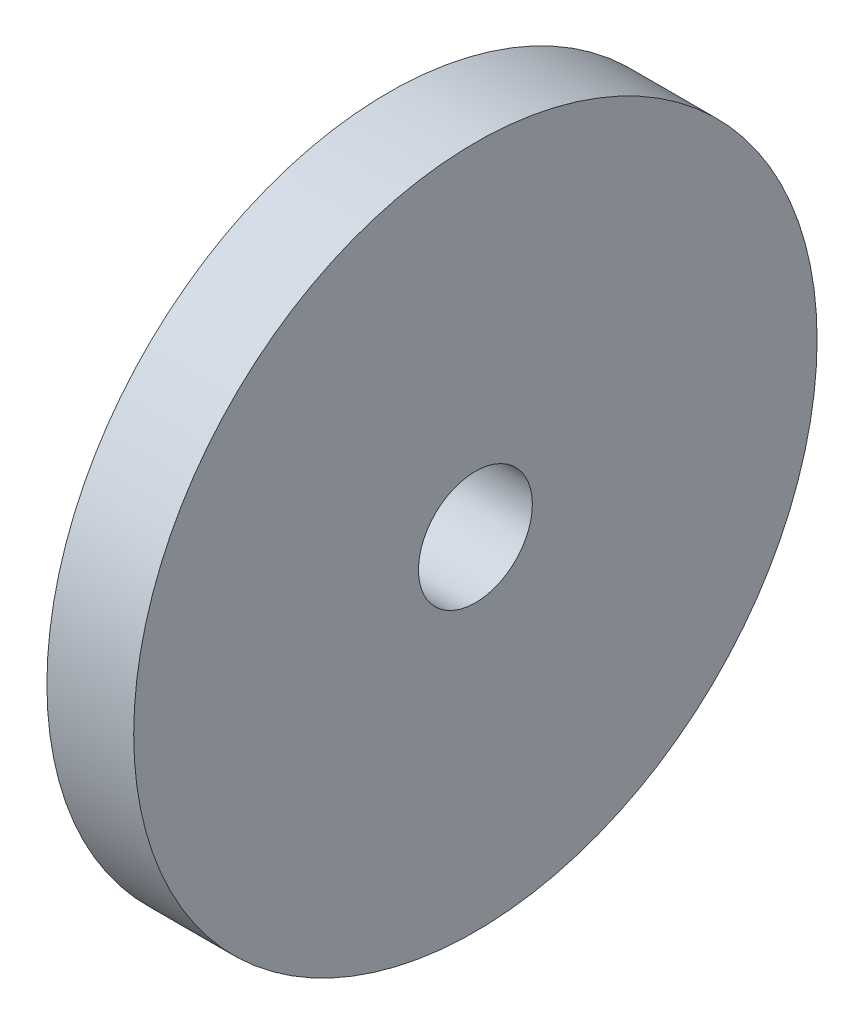
ISO-10303-21;
HEADER;
FILE_DESCRIPTION(('STEP AP214'),'2;1');
FILE_NAME('part.step','',(''),(''),'','','');
FILE_SCHEMA(('AUTOMOTIVE_DESIGN { 1 0 10303 214 1 1 1 1 }'));
ENDSEC;
DATA;
#1=APPLICATION_CONTEXT('core data for automotive mechanical design processes');
#2=APPLICATION_PROTOCOL_DEFINITION('international standard','automotive_design',2000,#1);
#3=PRODUCT_CONTEXT('',#1,'mechanical');
#4=PRODUCT('Part','Part','',(#3));
#5=PRODUCT_RELATED_PRODUCT_CATEGORY('part','',(#4));
#6=PRODUCT_DEFINITION_FORMATION('','',#4);
#7=PRODUCT_DEFINITION_CONTEXT('part definition',#1,'design');
#8=PRODUCT_DEFINITION('design','',#6,#7);
#9=PRODUCT_DEFINITION_SHAPE('','',#8);
#10=(LENGTH_UNIT() NAMED_UNIT(*) SI_UNIT(.MILLI.,.METRE.));
#11=(NAMED_UNIT(*) PLANE_ANGLE_UNIT() SI_UNIT($,.RADIAN.));
#12=(NAMED_UNIT(*) SI_UNIT($,.STERADIAN.) SOLID_ANGLE_UNIT());
#13=UNCERTAINTY_MEASURE_WITH_UNIT(LENGTH_MEASURE(1.E-05),#10,'distance_accuracy_value','');
#14=(GEOMETRIC_REPRESENTATION_CONTEXT(3) GLOBAL_UNCERTAINTY_ASSIGNED_CONTEXT((#13)) GLOBAL_UNIT_ASSIGNED_CONTEXT((#10,
#11,#12)) REPRESENTATION_CONTEXT('',''));
#15=CARTESIAN_POINT('',(0.,0.,0.));
#16=DIRECTION('',(0.,0.,1.));
#17=DIRECTION('',(1.,0.,0.));
#18=AXIS2_PLACEMENT_3D('',#15,#16,#17);
#19=CARTESIAN_POINT('',(0.,0.,-31.5));
#20=DIRECTION('',(1.,0.,0.));
#21=DIRECTION('',(0.,0.,-1.));
#22=AXIS2_PLACEMENT_3D('',#19,#20,#21);
#23=PLANE('',#22);
#24=CARTESIAN_POINT('',(0.,0.,-31.5));
#25=DIRECTION('',(1.,0.,0.));
#26=DIRECTION('',(0.,0.,-1.));
#27=AXIS2_PLACEMENT_3D('',#24,#25,#26);
#28=CIRCLE('',#27,5.25);
#29=CARTESIAN_POINT('',(0.,0.,-36.75));
#30=VERTEX_POINT('',#29);
#31=EDGE_CURVE('E49',#30,#30,#28,.T.);
#32=ORIENTED_EDGE('',*,*,#31,.T.);
#33=EDGE_LOOP('',(#32));
#34=FACE_BOUND('',#33,.T.);
#35=CARTESIAN_POINT('',(0.,0.,-31.5));
#36=DIRECTION('',(1.,0.,0.));
#37=DIRECTION('',(0.,0.,-1.));
#38=AXIS2_PLACEMENT_3D('',#35,#36,#37);
#39=CIRCLE('',#38,31.5);
#40=CARTESIAN_POINT('',(0.,0.,-63.));
#41=VERTEX_POINT('',#40);
#42=EDGE_CURVE('E10',#41,#41,#39,.T.);
#43=ORIENTED_EDGE('',*,*,#42,.F.);
#44=EDGE_LOOP('',(#43));
#45=FACE_BOUND('',#44,.T.);
#46=ADVANCED_FACE('F37',(#34,#45),#23,.F.);
#47=CARTESIAN_POINT('',(8.,0.,-31.5));
#48=DIRECTION('',(1.,0.,0.));
#49=DIRECTION('',(0.,0.,-1.));
#50=AXIS2_PLACEMENT_3D('',#47,#48,#49);
#51=CYLINDRICAL_SURFACE('',#50,31.5);
#52=CARTESIAN_POINT('',(8.,0.,-31.5));
#53=DIRECTION('',(1.,0.,0.));
#54=DIRECTION('',(0.,0.,-1.));
#55=AXIS2_PLACEMENT_3D('',#52,#53,#54);
#56=CIRCLE('',#55,31.5);
#57=CARTESIAN_POINT('',(8.,0.,-63.));
#58=VERTEX_POINT('',#57);
#59=EDGE_CURVE('E44',#58,#58,#56,.T.);
#60=ORIENTED_EDGE('',*,*,#59,.F.);
#61=EDGE_LOOP('',(#60));
#62=FACE_BOUND('',#61,.T.);
#63=ORIENTED_EDGE('',*,*,#42,.T.);
#64=EDGE_LOOP('',(#63));
#65=FACE_BOUND('',#64,.T.);
#66=ADVANCED_FACE('F66',(#62,#65),#51,.T.);
#67=CARTESIAN_POINT('',(8.,0.,0.));
#68=DIRECTION('',(-1.,0.,0.));
#69=DIRECTION('',(0.,0.,1.));
#70=AXIS2_PLACEMENT_3D('',#67,#68,#69);
#71=PLANE('',#70);
#72=CARTESIAN_POINT('',(8.,0.,-31.5));
#73=DIRECTION('',(1.,0.,0.));
#74=DIRECTION('',(0.,0.,-1.));
#75=AXIS2_PLACEMENT_3D('',#72,#73,#74);
#76=CIRCLE('',#75,5.25);
#77=CARTESIAN_POINT('',(8.,0.,-36.75));
#78=VERTEX_POINT('',#77);
#79=EDGE_CURVE('E54',#78,#78,#76,.T.);
#80=ORIENTED_EDGE('',*,*,#79,.F.);
#81=EDGE_LOOP('',(#80));
#82=FACE_BOUND('',#81,.T.);
#83=ORIENTED_EDGE('',*,*,#59,.T.);
#84=EDGE_LOOP('',(#83));
#85=FACE_BOUND('',#84,.T.);
#86=ADVANCED_FACE('F64',(#82,#85),#71,.F.);
#87=CARTESIAN_POINT('',(-2.,0.,-31.5));
#88=DIRECTION('',(1.,0.,0.));
#89=DIRECTION('',(0.,0.,-1.));
#90=AXIS2_PLACEMENT_3D('',#87,#88,#89);
#91=CYLINDRICAL_SURFACE('',#90,5.25);
#92=ORIENTED_EDGE('',*,*,#79,.T.);
#93=EDGE_LOOP('',(#92));
#94=FACE_BOUND('',#93,.T.);
#95=ORIENTED_EDGE('',*,*,#31,.F.);
#96=EDGE_LOOP('',(#95));
#97=FACE_BOUND('',#96,.T.);
#98=ADVANCED_FACE('F61',(#94,#97),#91,.F.);
#99=CLOSED_SHELL('',(#46,#66,#86,#98));
#100=MANIFOLD_SOLID_BREP('B2',#99);
#101=ADVANCED_BREP_SHAPE_REPRESENTATION('',(#18,#100),#14);
#102=SHAPE_DEFINITION_REPRESENTATION(#9,#101);
ENDSEC;
END-ISO-10303-21;
